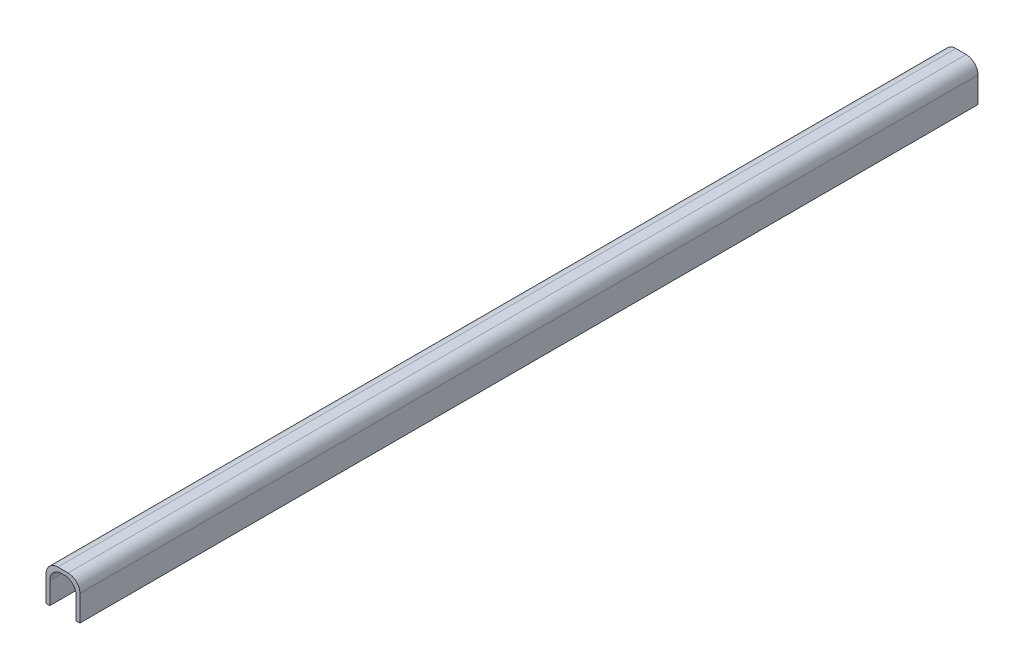
ISO-10303-21;
HEADER;
FILE_DESCRIPTION(('STEP AP214'),'2;1');
FILE_NAME('part.step','',(''),(''),'','','');
FILE_SCHEMA(('AUTOMOTIVE_DESIGN { 1 0 10303 214 1 1 1 1 }'));
ENDSEC;
DATA;
#1=APPLICATION_CONTEXT('core data for automotive mechanical design processes');
#2=APPLICATION_PROTOCOL_DEFINITION('international standard','automotive_design',2000,#1);
#3=PRODUCT_CONTEXT('',#1,'mechanical');
#4=PRODUCT('Part','Part','',(#3));
#5=PRODUCT_RELATED_PRODUCT_CATEGORY('part','',(#4));
#6=PRODUCT_DEFINITION_FORMATION('','',#4);
#7=PRODUCT_DEFINITION_CONTEXT('part definition',#1,'design');
#8=PRODUCT_DEFINITION('design','',#6,#7);
#9=PRODUCT_DEFINITION_SHAPE('','',#8);
#10=(LENGTH_UNIT() NAMED_UNIT(*) SI_UNIT(.MILLI.,.METRE.));
#11=(NAMED_UNIT(*) PLANE_ANGLE_UNIT() SI_UNIT($,.RADIAN.));
#12=(NAMED_UNIT(*) SI_UNIT($,.STERADIAN.) SOLID_ANGLE_UNIT());
#13=UNCERTAINTY_MEASURE_WITH_UNIT(LENGTH_MEASURE(1.E-05),#10,'distance_accuracy_value','');
#14=(GEOMETRIC_REPRESENTATION_CONTEXT(3) GLOBAL_UNCERTAINTY_ASSIGNED_CONTEXT((#13)) GLOBAL_UNIT_ASSIGNED_CONTEXT((#10,
#11,#12)) REPRESENTATION_CONTEXT('',''));
#15=CARTESIAN_POINT('',(0.,0.,0.));
#16=DIRECTION('',(0.,0.,1.));
#17=DIRECTION('',(1.,0.,0.));
#18=AXIS2_PLACEMENT_3D('',#15,#16,#17);
#19=CARTESIAN_POINT('',(0.,0.,825.));
#20=DIRECTION('',(0.,1.,0.));
#21=DIRECTION('',(0.,0.,1.));
#22=AXIS2_PLACEMENT_3D('',#19,#20,#21);
#23=PLANE('',#22);
#24=DIRECTION('',(0.,0.,-1.));
#25=VECTOR('',#24,1.);
#26=CARTESIAN_POINT('',(3.175,0.,825.));
#27=LINE('',#26,#25);
#28=CARTESIAN_POINT('',(3.17500000000004,0.,760.));
#29=VERTEX_POINT('',#28);
#30=CARTESIAN_POINT('',(3.175,0.,0.));
#31=VERTEX_POINT('',#30);
#32=EDGE_CURVE('E40',#29,#31,#27,.T.);
#33=ORIENTED_EDGE('',*,*,#32,.F.);
#34=DIRECTION('',(1.,0.,0.));
#35=VECTOR('',#34,1.);
#36=CARTESIAN_POINT('',(-796.298,0.,760.));
#37=LINE('',#36,#35);
#38=CARTESIAN_POINT('',(0.,0.,760.));
#39=VERTEX_POINT('',#38);
#40=EDGE_CURVE('E130',#39,#29,#37,.T.);
#41=ORIENTED_EDGE('',*,*,#40,.F.);
#42=DIRECTION('',(0.,0.,-1.));
#43=VECTOR('',#42,1.);
#44=CARTESIAN_POINT('',(0.,0.,825.));
#45=LINE('',#44,#43);
#46=CARTESIAN_POINT('',(0.,0.,0.));
#47=VERTEX_POINT('',#46);
#48=EDGE_CURVE('E54',#39,#47,#45,.T.);
#49=ORIENTED_EDGE('',*,*,#48,.T.);
#50=DIRECTION('',(1.,0.,0.));
#51=VECTOR('',#50,1.);
#52=CARTESIAN_POINT('',(0.,0.,0.));
#53=LINE('',#52,#51);
#54=EDGE_CURVE('E172',#47,#31,#53,.T.);
#55=ORIENTED_EDGE('',*,*,#54,.T.);
#56=EDGE_LOOP('',(#33,#41,#49,#55));
#57=FACE_BOUND('',#56,.T.);
#58=ADVANCED_FACE('F33',(#57),#23,.F.);
#59=CARTESIAN_POINT('',(3.175,0.,825.));
#60=DIRECTION('',(-1.,0.,0.));
#61=DIRECTION('',(0.,0.,1.));
#62=AXIS2_PLACEMENT_3D('',#59,#60,#61);
#63=PLANE('',#62);
#64=DIRECTION('',(0.,0.,-1.));
#65=VECTOR('',#64,1.);
#66=CARTESIAN_POINT('',(3.175,18.5749999999999,825.));
#67=LINE('',#66,#65);
#68=CARTESIAN_POINT('',(3.175,18.575,760.));
#69=VERTEX_POINT('',#68);
#70=CARTESIAN_POINT('',(3.175,18.5749999999999,0.));
#71=VERTEX_POINT('',#70);
#72=EDGE_CURVE('E157',#69,#71,#67,.T.);
#73=ORIENTED_EDGE('',*,*,#72,.F.);
#74=DIRECTION('',(0.,-1.,0.));
#75=VECTOR('',#74,1.);
#76=CARTESIAN_POINT('',(3.175,0.,760.));
#77=LINE('',#76,#75);
#78=EDGE_CURVE('E167',#69,#29,#77,.T.);
#79=ORIENTED_EDGE('',*,*,#78,.T.);
#80=ORIENTED_EDGE('',*,*,#32,.T.);
#81=DIRECTION('',(0.,1.,0.));
#82=VECTOR('',#81,1.);
#83=CARTESIAN_POINT('',(3.175,0.,0.));
#84=LINE('',#83,#82);
#85=EDGE_CURVE('E165',#31,#71,#84,.T.);
#86=ORIENTED_EDGE('',*,*,#85,.T.);
#87=EDGE_LOOP('',(#73,#79,#80,#86));
#88=FACE_BOUND('',#87,.T.);
#89=ADVANCED_FACE('F164',(#88),#63,.F.);
#90=CARTESIAN_POINT('',(13.175,18.575,825.));
#91=DIRECTION('',(0.,0.,-1.));
#92=DIRECTION('',(-1.,0.,0.));
#93=AXIS2_PLACEMENT_3D('',#90,#91,#92);
#94=CYLINDRICAL_SURFACE('',#93,10.);
#95=DIRECTION('',(0.,0.,-1.));
#96=VECTOR('',#95,1.);
#97=CARTESIAN_POINT('',(13.1750000000001,28.575,825.));
#98=LINE('',#97,#96);
#99=CARTESIAN_POINT('',(13.1750000000001,28.575,760.));
#100=VERTEX_POINT('',#99);
#101=CARTESIAN_POINT('',(13.1750000000001,28.575,0.));
#102=VERTEX_POINT('',#101);
#103=EDGE_CURVE('E155',#100,#102,#98,.T.);
#104=ORIENTED_EDGE('',*,*,#103,.F.);
#105=CARTESIAN_POINT('',(13.175,18.575,760.));
#106=DIRECTION('',(0.,0.,-1.));
#107=DIRECTION('',(-1.,0.,0.));
#108=AXIS2_PLACEMENT_3D('',#105,#106,#107);
#109=CIRCLE('',#108,10.);
#110=EDGE_CURVE('E178',#100,#69,#109,.F.);
#111=ORIENTED_EDGE('',*,*,#110,.T.);
#112=ORIENTED_EDGE('',*,*,#72,.T.);
#113=CARTESIAN_POINT('',(13.175,18.575,0.));
#114=DIRECTION('',(0.,0.,-1.));
#115=DIRECTION('',(-1.,0.,0.));
#116=AXIS2_PLACEMENT_3D('',#113,#114,#115);
#117=CIRCLE('',#116,10.);
#118=EDGE_CURVE('E175',#71,#102,#117,.T.);
#119=ORIENTED_EDGE('',*,*,#118,.T.);
#120=EDGE_LOOP('',(#104,#111,#112,#119));
#121=FACE_BOUND('',#120,.T.);
#122=ADVANCED_FACE('F238',(#121),#94,.F.);
#123=CARTESIAN_POINT('',(13.1750000000001,28.575,825.));
#124=DIRECTION('',(0.,1.,0.));
#125=DIRECTION('',(0.,0.,1.));
#126=AXIS2_PLACEMENT_3D('',#123,#124,#125);
#127=PLANE('',#126);
#128=DIRECTION('',(0.,0.,-1.));
#129=VECTOR('',#128,1.);
#130=CARTESIAN_POINT('',(15.5269999999999,28.575,825.));
#131=LINE('',#130,#129);
#132=CARTESIAN_POINT('',(15.5269999999999,28.575,760.));
#133=VERTEX_POINT('',#132);
#134=CARTESIAN_POINT('',(15.5269999999999,28.575,0.));
#135=VERTEX_POINT('',#134);
#136=EDGE_CURVE('E153',#133,#135,#131,.T.);
#137=ORIENTED_EDGE('',*,*,#136,.F.);
#138=DIRECTION('',(-1.,0.,0.));
#139=VECTOR('',#138,1.);
#140=CARTESIAN_POINT('',(13.1750000000001,28.575,760.));
#141=LINE('',#140,#139);
#142=EDGE_CURVE('E233',#133,#100,#141,.T.);
#143=ORIENTED_EDGE('',*,*,#142,.T.);
#144=ORIENTED_EDGE('',*,*,#103,.T.);
#145=DIRECTION('',(1.,0.,0.));
#146=VECTOR('',#145,1.);
#147=CARTESIAN_POINT('',(13.1750000000001,28.575,0.));
#148=LINE('',#147,#146);
#149=EDGE_CURVE('E183',#102,#135,#148,.T.);
#150=ORIENTED_EDGE('',*,*,#149,.T.);
#151=EDGE_LOOP('',(#137,#143,#144,#150));
#152=FACE_BOUND('',#151,.T.);
#153=ADVANCED_FACE('F241',(#152),#127,.F.);
#154=CARTESIAN_POINT('',(15.527,18.575,825.));
#155=DIRECTION('',(0.,0.,-1.));
#156=DIRECTION('',(-1.,0.,0.));
#157=AXIS2_PLACEMENT_3D('',#154,#155,#156);
#158=CYLINDRICAL_SURFACE('',#157,10.);
#159=DIRECTION('',(0.,0.,-1.));
#160=VECTOR('',#159,1.);
#161=CARTESIAN_POINT('',(25.527,18.5749999999999,825.));
#162=LINE('',#161,#160);
#163=CARTESIAN_POINT('',(25.527,18.5749999999999,760.));
#164=VERTEX_POINT('',#163);
#165=CARTESIAN_POINT('',(25.527,18.5749999999999,0.));
#166=VERTEX_POINT('',#165);
#167=EDGE_CURVE('E146',#164,#166,#162,.T.);
#168=ORIENTED_EDGE('',*,*,#167,.F.);
#169=CARTESIAN_POINT('',(15.527,18.575,760.));
#170=DIRECTION('',(0.,0.,-1.));
#171=DIRECTION('',(-1.,0.,0.));
#172=AXIS2_PLACEMENT_3D('',#169,#170,#171);
#173=CIRCLE('',#172,10.);
#174=EDGE_CURVE('E230',#164,#133,#173,.F.);
#175=ORIENTED_EDGE('',*,*,#174,.T.);
#176=ORIENTED_EDGE('',*,*,#136,.T.);
#177=CARTESIAN_POINT('',(15.527,18.575,0.));
#178=DIRECTION('',(0.,0.,-1.));
#179=DIRECTION('',(-1.,0.,0.));
#180=AXIS2_PLACEMENT_3D('',#177,#178,#179);
#181=CIRCLE('',#180,10.);
#182=EDGE_CURVE('E186',#135,#166,#181,.T.);
#183=ORIENTED_EDGE('',*,*,#182,.T.);
#184=EDGE_LOOP('',(#168,#175,#176,#183));
#185=FACE_BOUND('',#184,.T.);
#186=ADVANCED_FACE('F245',(#185),#158,.F.);
#187=CARTESIAN_POINT('',(25.527,0.,825.));
#188=DIRECTION('',(1.,0.,0.));
#189=DIRECTION('',(0.,0.,-1.));
#190=AXIS2_PLACEMENT_3D('',#187,#188,#189);
#191=PLANE('',#190);
#192=DIRECTION('',(0.,0.,-1.));
#193=VECTOR('',#192,1.);
#194=CARTESIAN_POINT('',(25.527,0.,825.));
#195=LINE('',#194,#193);
#196=CARTESIAN_POINT('',(25.527,0.,760.));
#197=VERTEX_POINT('',#196);
#198=CARTESIAN_POINT('',(25.527,0.,0.));
#199=VERTEX_POINT('',#198);
#200=EDGE_CURVE('E144',#197,#199,#195,.T.);
#201=ORIENTED_EDGE('',*,*,#200,.F.);
#202=DIRECTION('',(0.,1.,0.));
#203=VECTOR('',#202,1.);
#204=CARTESIAN_POINT('',(25.527,0.,760.));
#205=LINE('',#204,#203);
#206=EDGE_CURVE('E126',#197,#164,#205,.T.);
#207=ORIENTED_EDGE('',*,*,#206,.T.);
#208=ORIENTED_EDGE('',*,*,#167,.T.);
#209=DIRECTION('',(0.,-1.,0.));
#210=VECTOR('',#209,1.);
#211=CARTESIAN_POINT('',(25.527,0.,0.));
#212=LINE('',#211,#210);
#213=EDGE_CURVE('E189',#166,#199,#212,.T.);
#214=ORIENTED_EDGE('',*,*,#213,.T.);
#215=EDGE_LOOP('',(#201,#207,#208,#214));
#216=FACE_BOUND('',#215,.T.);
#217=ADVANCED_FACE('F248',(#216),#191,.F.);
#218=CARTESIAN_POINT('',(28.702,0.,825.));
#219=DIRECTION('',(0.,1.,0.));
#220=DIRECTION('',(0.,0.,1.));
#221=AXIS2_PLACEMENT_3D('',#218,#219,#220);
#222=PLANE('',#221);
#223=DIRECTION('',(0.,0.,-1.));
#224=VECTOR('',#223,1.);
#225=CARTESIAN_POINT('',(28.702,0.,825.));
#226=LINE('',#225,#224);
#227=CARTESIAN_POINT('',(28.702,0.,760.));
#228=VERTEX_POINT('',#227);
#229=CARTESIAN_POINT('',(28.702,0.,0.));
#230=VERTEX_POINT('',#229);
#231=EDGE_CURVE('E136',#228,#230,#226,.T.);
#232=ORIENTED_EDGE('',*,*,#231,.F.);
#233=EDGE_CURVE('E120',#197,#228,#37,.T.);
#234=ORIENTED_EDGE('',*,*,#233,.F.);
#235=ORIENTED_EDGE('',*,*,#200,.T.);
#236=DIRECTION('',(1.,0.,0.));
#237=VECTOR('',#236,1.);
#238=CARTESIAN_POINT('',(28.702,0.,0.));
#239=LINE('',#238,#237);
#240=EDGE_CURVE('E142',#199,#230,#239,.T.);
#241=ORIENTED_EDGE('',*,*,#240,.T.);
#242=EDGE_LOOP('',(#232,#234,#235,#241));
#243=FACE_BOUND('',#242,.T.);
#244=ADVANCED_FACE('F140',(#243),#222,.F.);
#245=CARTESIAN_POINT('',(28.702,0.,825.));
#246=DIRECTION('',(-1.,0.,0.));
#247=DIRECTION('',(0.,0.,1.));
#248=AXIS2_PLACEMENT_3D('',#245,#246,#247);
#249=PLANE('',#248);
#250=DIRECTION('',(0.,0.,-1.));
#251=VECTOR('',#250,1.);
#252=CARTESIAN_POINT('',(28.702,21.7499999999999,825.));
#253=LINE('',#252,#251);
#254=CARTESIAN_POINT('',(28.702,21.75,760.));
#255=VERTEX_POINT('',#254);
#256=CARTESIAN_POINT('',(28.702,21.7499999999999,0.));
#257=VERTEX_POINT('',#256);
#258=EDGE_CURVE('E138',#255,#257,#253,.T.);
#259=ORIENTED_EDGE('',*,*,#258,.F.);
#260=DIRECTION('',(0.,1.,0.));
#261=VECTOR('',#260,1.);
#262=CARTESIAN_POINT('',(28.702,0.,760.));
#263=LINE('',#262,#261);
#264=EDGE_CURVE('E123',#228,#255,#263,.T.);
#265=ORIENTED_EDGE('',*,*,#264,.F.);
#266=ORIENTED_EDGE('',*,*,#231,.T.);
#267=DIRECTION('',(0.,1.,0.));
#268=VECTOR('',#267,1.);
#269=CARTESIAN_POINT('',(28.702,0.,0.));
#270=LINE('',#269,#268);
#271=EDGE_CURVE('E193',#230,#257,#270,.T.);
#272=ORIENTED_EDGE('',*,*,#271,.T.);
#273=EDGE_LOOP('',(#259,#265,#266,#272));
#274=FACE_BOUND('',#273,.T.);
#275=ADVANCED_FACE('F134',(#274),#249,.F.);
#276=CARTESIAN_POINT('',(18.702,21.75,825.));
#277=DIRECTION('',(0.,0.,-1.));
#278=DIRECTION('',(-1.,0.,0.));
#279=AXIS2_PLACEMENT_3D('',#276,#277,#278);
#280=CYLINDRICAL_SURFACE('',#279,10.);
#281=DIRECTION('',(0.,0.,-1.));
#282=VECTOR('',#281,1.);
#283=CARTESIAN_POINT('',(18.7019999999999,31.75,825.));
#284=LINE('',#283,#282);
#285=CARTESIAN_POINT('',(18.7019999999999,31.75,760.));
#286=VERTEX_POINT('',#285);
#287=CARTESIAN_POINT('',(18.7019999999999,31.75,0.));
#288=VERTEX_POINT('',#287);
#289=EDGE_CURVE('E148',#286,#288,#284,.T.);
#290=ORIENTED_EDGE('',*,*,#289,.F.);
#291=CARTESIAN_POINT('',(18.702,21.75,760.));
#292=DIRECTION('',(0.,0.,-1.));
#293=DIRECTION('',(-1.,0.,0.));
#294=AXIS2_PLACEMENT_3D('',#291,#292,#293);
#295=CIRCLE('',#294,10.);
#296=EDGE_CURVE('E225',#286,#255,#295,.T.);
#297=ORIENTED_EDGE('',*,*,#296,.T.);
#298=ORIENTED_EDGE('',*,*,#258,.T.);
#299=CARTESIAN_POINT('',(18.702,21.75,0.));
#300=DIRECTION('',(0.,0.,1.));
#301=DIRECTION('',(1.,0.,0.));
#302=AXIS2_PLACEMENT_3D('',#299,#300,#301);
#303=CIRCLE('',#302,10.);
#304=EDGE_CURVE('E195',#257,#288,#303,.T.);
#305=ORIENTED_EDGE('',*,*,#304,.T.);
#306=EDGE_LOOP('',(#290,#297,#298,#305));
#307=FACE_BOUND('',#306,.T.);
#308=ADVANCED_FACE('F220',(#307),#280,.T.);
#309=CARTESIAN_POINT('',(10.0000000000001,31.75,825.));
#310=DIRECTION('',(0.,-1.,0.));
#311=DIRECTION('',(0.,0.,-1.));
#312=AXIS2_PLACEMENT_3D('',#309,#310,#311);
#313=PLANE('',#312);
#314=DIRECTION('',(0.,0.,-1.));
#315=VECTOR('',#314,1.);
#316=CARTESIAN_POINT('',(10.0000000000001,31.75,825.));
#317=LINE('',#316,#315);
#318=CARTESIAN_POINT('',(10.0000000000001,31.75,760.));
#319=VERTEX_POINT('',#318);
#320=CARTESIAN_POINT('',(10.0000000000001,31.75,0.));
#321=VERTEX_POINT('',#320);
#322=EDGE_CURVE('E209',#319,#321,#317,.T.);
#323=ORIENTED_EDGE('',*,*,#322,.F.);
#324=DIRECTION('',(1.,0.,0.));
#325=VECTOR('',#324,1.);
#326=CARTESIAN_POINT('',(10.0000000000001,31.75,760.));
#327=LINE('',#326,#325);
#328=EDGE_CURVE('E217',#319,#286,#327,.T.);
#329=ORIENTED_EDGE('',*,*,#328,.T.);
#330=ORIENTED_EDGE('',*,*,#289,.T.);
#331=DIRECTION('',(-1.,0.,0.));
#332=VECTOR('',#331,1.);
#333=CARTESIAN_POINT('',(10.0000000000001,31.75,0.));
#334=LINE('',#333,#332);
#335=EDGE_CURVE('E198',#288,#321,#334,.T.);
#336=ORIENTED_EDGE('',*,*,#335,.T.);
#337=EDGE_LOOP('',(#323,#329,#330,#336));
#338=FACE_BOUND('',#337,.T.);
#339=ADVANCED_FACE('F214',(#338),#313,.F.);
#340=CARTESIAN_POINT('',(10.,21.75,825.));
#341=DIRECTION('',(0.,0.,-1.));
#342=DIRECTION('',(-1.,0.,0.));
#343=AXIS2_PLACEMENT_3D('',#340,#341,#342);
#344=CYLINDRICAL_SURFACE('',#343,10.);
#345=DIRECTION('',(0.,0.,-1.));
#346=VECTOR('',#345,1.);
#347=CARTESIAN_POINT('',(0.,21.7499999999999,825.));
#348=LINE('',#347,#346);
#349=CARTESIAN_POINT('',(0.,21.7499999999999,760.));
#350=VERTEX_POINT('',#349);
#351=CARTESIAN_POINT('',(0.,21.7499999999999,0.));
#352=VERTEX_POINT('',#351);
#353=EDGE_CURVE('E207',#350,#352,#348,.T.);
#354=ORIENTED_EDGE('',*,*,#353,.F.);
#355=CARTESIAN_POINT('',(10.,21.75,760.));
#356=DIRECTION('',(0.,0.,-1.));
#357=DIRECTION('',(-1.,0.,0.));
#358=AXIS2_PLACEMENT_3D('',#355,#356,#357);
#359=CIRCLE('',#358,10.);
#360=EDGE_CURVE('E47',#350,#319,#359,.T.);
#361=ORIENTED_EDGE('',*,*,#360,.T.);
#362=ORIENTED_EDGE('',*,*,#322,.T.);
#363=CARTESIAN_POINT('',(10.,21.75,0.));
#364=DIRECTION('',(0.,0.,1.));
#365=DIRECTION('',(-1.,0.,0.));
#366=AXIS2_PLACEMENT_3D('',#363,#364,#365);
#367=CIRCLE('',#366,10.);
#368=EDGE_CURVE('E201',#321,#352,#367,.T.);
#369=ORIENTED_EDGE('',*,*,#368,.T.);
#370=EDGE_LOOP('',(#354,#361,#362,#369));
#371=FACE_BOUND('',#370,.T.);
#372=ADVANCED_FACE('F223',(#371),#344,.T.);
#373=CARTESIAN_POINT('',(0.,0.,825.));
#374=DIRECTION('',(1.,0.,0.));
#375=DIRECTION('',(0.,0.,-1.));
#376=AXIS2_PLACEMENT_3D('',#373,#374,#375);
#377=PLANE('',#376);
#378=ORIENTED_EDGE('',*,*,#48,.F.);
#379=DIRECTION('',(0.,1.,0.));
#380=VECTOR('',#379,1.);
#381=CARTESIAN_POINT('',(0.,0.,760.));
#382=LINE('',#381,#380);
#383=EDGE_CURVE('E11',#39,#350,#382,.T.);
#384=ORIENTED_EDGE('',*,*,#383,.T.);
#385=ORIENTED_EDGE('',*,*,#353,.T.);
#386=DIRECTION('',(0.,-1.,0.));
#387=VECTOR('',#386,1.);
#388=CARTESIAN_POINT('',(0.,0.,0.));
#389=LINE('',#388,#387);
#390=EDGE_CURVE('E204',#352,#47,#389,.T.);
#391=ORIENTED_EDGE('',*,*,#390,.T.);
#392=EDGE_LOOP('',(#378,#384,#385,#391));
#393=FACE_BOUND('',#392,.T.);
#394=ADVANCED_FACE('F319',(#393),#377,.F.);
#395=CARTESIAN_POINT('',(13.175,18.575,0.));
#396=DIRECTION('',(0.,0.,-1.));
#397=DIRECTION('',(-1.,0.,0.));
#398=AXIS2_PLACEMENT_3D('',#395,#396,#397);
#399=PLANE('',#398);
#400=ORIENTED_EDGE('',*,*,#54,.F.);
#401=ORIENTED_EDGE('',*,*,#390,.F.);
#402=ORIENTED_EDGE('',*,*,#368,.F.);
#403=ORIENTED_EDGE('',*,*,#335,.F.);
#404=ORIENTED_EDGE('',*,*,#304,.F.);
#405=ORIENTED_EDGE('',*,*,#271,.F.);
#406=ORIENTED_EDGE('',*,*,#240,.F.);
#407=ORIENTED_EDGE('',*,*,#213,.F.);
#408=ORIENTED_EDGE('',*,*,#182,.F.);
#409=ORIENTED_EDGE('',*,*,#149,.F.);
#410=ORIENTED_EDGE('',*,*,#118,.F.);
#411=ORIENTED_EDGE('',*,*,#85,.F.);
#412=EDGE_LOOP('',(#400,#401,#402,#403,#404,#405,#406,#407,#408,#409,#410,#411));
#413=FACE_BOUND('',#412,.T.);
#414=ADVANCED_FACE('F170',(#413),#399,.T.);
#415=CARTESIAN_POINT('',(-796.298,0.,760.));
#416=DIRECTION('',(0.,0.,-1.));
#417=DIRECTION('',(-1.,0.,0.));
#418=AXIS2_PLACEMENT_3D('',#415,#416,#417);
#419=PLANE('',#418);
#420=ORIENTED_EDGE('',*,*,#110,.F.);
#421=ORIENTED_EDGE('',*,*,#142,.F.);
#422=ORIENTED_EDGE('',*,*,#174,.F.);
#423=ORIENTED_EDGE('',*,*,#206,.F.);
#424=ORIENTED_EDGE('',*,*,#233,.T.);
#425=ORIENTED_EDGE('',*,*,#264,.T.);
#426=ORIENTED_EDGE('',*,*,#296,.F.);
#427=ORIENTED_EDGE('',*,*,#328,.F.);
#428=ORIENTED_EDGE('',*,*,#360,.F.);
#429=ORIENTED_EDGE('',*,*,#383,.F.);
#430=ORIENTED_EDGE('',*,*,#40,.T.);
#431=ORIENTED_EDGE('',*,*,#78,.F.);
#432=EDGE_LOOP('',(#420,#421,#422,#423,#424,#425,#426,#427,#428,#429,#430,#431));
#433=FACE_BOUND('',#432,.T.);
#434=ADVANCED_FACE('F122',(#433),#419,.F.);
#435=CLOSED_SHELL('',(#58,#89,#122,#153,#186,#217,#244,#275,#308,#339,#372,#394,#414,#434));
#436=MANIFOLD_SOLID_BREP('B2',#435);
#437=ADVANCED_BREP_SHAPE_REPRESENTATION('',(#18,#436),#14);
#438=SHAPE_DEFINITION_REPRESENTATION(#9,#437);
ENDSEC;
END-ISO-10303-21;
